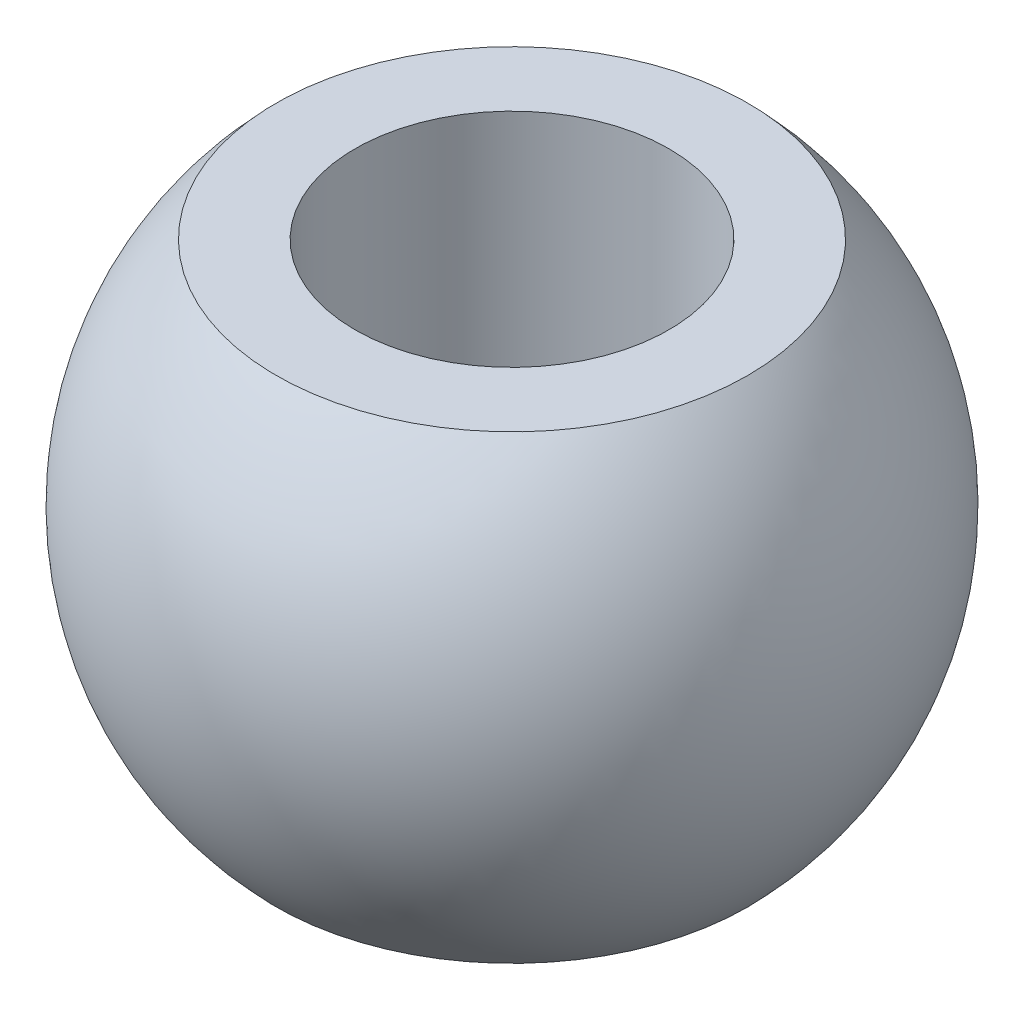
ISO-10303-21;
HEADER;
FILE_DESCRIPTION(('STEP AP214'),'2;1');
FILE_NAME('part.step','',(''),(''),'','','');
FILE_SCHEMA(('AUTOMOTIVE_DESIGN { 1 0 10303 214 1 1 1 1 }'));
ENDSEC;
DATA;
#1=APPLICATION_CONTEXT('core data for automotive mechanical design processes');
#2=APPLICATION_PROTOCOL_DEFINITION('international standard','automotive_design',2000,#1);
#3=PRODUCT_CONTEXT('',#1,'mechanical');
#4=PRODUCT('Part','Part','',(#3));
#5=PRODUCT_RELATED_PRODUCT_CATEGORY('part','',(#4));
#6=PRODUCT_DEFINITION_FORMATION('','',#4);
#7=PRODUCT_DEFINITION_CONTEXT('part definition',#1,'design');
#8=PRODUCT_DEFINITION('design','',#6,#7);
#9=PRODUCT_DEFINITION_SHAPE('','',#8);
#10=(LENGTH_UNIT() NAMED_UNIT(*) SI_UNIT(.MILLI.,.METRE.));
#11=(NAMED_UNIT(*) PLANE_ANGLE_UNIT() SI_UNIT($,.RADIAN.));
#12=(NAMED_UNIT(*) SI_UNIT($,.STERADIAN.) SOLID_ANGLE_UNIT());
#13=UNCERTAINTY_MEASURE_WITH_UNIT(LENGTH_MEASURE(1.E-05),#10,'distance_accuracy_value','');
#14=(GEOMETRIC_REPRESENTATION_CONTEXT(3) GLOBAL_UNCERTAINTY_ASSIGNED_CONTEXT((#13)) GLOBAL_UNIT_ASSIGNED_CONTEXT((#10,
#11,#12)) REPRESENTATION_CONTEXT('',''));
#15=CARTESIAN_POINT('',(0.,0.,0.));
#16=DIRECTION('',(0.,0.,1.));
#17=DIRECTION('',(1.,0.,0.));
#18=AXIS2_PLACEMENT_3D('',#15,#16,#17);
#19=CARTESIAN_POINT('',(0.,0.,0.));
#20=DIRECTION('',(0.,1.,0.));
#21=DIRECTION('',(1.,0.,0.));
#22=AXIS2_PLACEMENT_3D('',#19,#20,#21);
#23=SPHERICAL_SURFACE('',#22,3.15);
#24=CARTESIAN_POINT('',(0.,2.2,0.));
#25=DIRECTION('',(0.,1.,0.));
#26=DIRECTION('',(0.,0.,1.));
#27=AXIS2_PLACEMENT_3D('',#24,#25,#26);
#28=CIRCLE('',#27,2.2544400635191);
#29=CARTESIAN_POINT('',(2.2544400635191,2.2,0.));
#30=VERTEX_POINT('',#29);
#31=EDGE_CURVE('E45',#30,#30,#28,.T.);
#32=CARTESIAN_POINT('',(0.,-2.2,0.));
#33=DIRECTION('',(0.,1.,0.));
#34=DIRECTION('',(0.,0.,1.));
#35=AXIS2_PLACEMENT_3D('',#32,#33,#34);
#36=CIRCLE('',#35,2.2544400635191);
#37=CARTESIAN_POINT('',(2.2544400635191,-2.2,0.));
#38=VERTEX_POINT('',#37);
#39=EDGE_CURVE('E10',#38,#38,#36,.T.);
#40=CARTESIAN_POINT('',(2.2544400635191,2.2,0.));
#41=CARTESIAN_POINT('',(2.28987812241705,2.16368647952332,0.));
#42=CARTESIAN_POINT('',(2.32443726141813,2.12651538343294,0.));
#43=CARTESIAN_POINT('',(2.39172039303971,2.05054781674715,0.));
#44=CARTESIAN_POINT('',(2.42444438566022,2.01175134615174,0.));
#45=CARTESIAN_POINT('',(2.48797991793386,1.93262280717831,0.));
#46=CARTESIAN_POINT('',(2.518791457587,1.89229073880028,0.));
#47=CARTESIAN_POINT('',(2.57843039040885,1.81018538297469,0.));
#48=CARTESIAN_POINT('',(2.60725778357756,1.76841209552712,0.));
#49=CARTESIAN_POINT('',(2.6628610547114,1.68352177265631,0.));
#50=CARTESIAN_POINT('',(2.68963693267654,1.64040473723306,0.));
#51=CARTESIAN_POINT('',(2.74107467681044,1.55292759977531,0.));
#52=CARTESIAN_POINT('',(2.7657365429792,1.50856749774079,0.));
#53=CARTESIAN_POINT('',(2.81288868045417,1.4187077910684,0.));
#54=CARTESIAN_POINT('',(2.83537895176039,1.37320818643051,0.));
#55=CARTESIAN_POINT('',(2.87813539241444,1.28117570421314,0.));
#56=CARTESIAN_POINT('',(2.89840156176227,1.23464282663364,0.));
#57=CARTESIAN_POINT('',(2.93666248245955,1.14065243918694,0.));
#58=CARTESIAN_POINT('',(2.95465723380899,1.09319492931974,0.));
#59=CARTESIAN_POINT('',(2.98833330600524,0.997466077079587,0.));
#60=CARTESIAN_POINT('',(3.00401462685205,0.94919473470664,0.));
#61=CARTESIAN_POINT('',(3.03302722662306,0.851950917202105,0.));
#62=CARTESIAN_POINT('',(3.04635850554726,0.802978442070517,0.));
#63=CARTESIAN_POINT('',(3.07063989675882,0.704446695767136,0.));
#64=CARTESIAN_POINT('',(3.08159000904619,0.654887424595344,0.));
#65=CARTESIAN_POINT('',(3.10108350160426,0.555297792923554,0.));
#66=CARTESIAN_POINT('',(3.10962688187497,0.505267432423556,0.));
#67=CARTESIAN_POINT('',(3.12428696405253,0.404852428668045,0.));
#68=CARTESIAN_POINT('',(3.13040366595937,0.354467785412531,0.));
#69=CARTESIAN_POINT('',(3.1401961106608,0.253461849866987,0.));
#70=CARTESIAN_POINT('',(3.14387185345539,0.202840557576957,0.));
#71=CARTESIAN_POINT('',(3.14877379812499,0.101479510191285,0.));
#72=CARTESIAN_POINT('',(3.15,0.0507397550956423,0.));
#73=CARTESIAN_POINT('',(3.15,-0.050739755095643,0.));
#74=CARTESIAN_POINT('',(3.14877379812499,-0.101479510191286,0.));
#75=CARTESIAN_POINT('',(3.14387185345539,-0.202840557576958,0.));
#76=CARTESIAN_POINT('',(3.1401961106608,-0.253461849866988,0.));
#77=CARTESIAN_POINT('',(3.13040366595937,-0.354467785412531,0.));
#78=CARTESIAN_POINT('',(3.12428696405253,-0.404852428668045,0.));
#79=CARTESIAN_POINT('',(3.10962688187497,-0.505267432423557,0.));
#80=CARTESIAN_POINT('',(3.10108350160426,-0.555297792923554,0.));
#81=CARTESIAN_POINT('',(3.08159000904619,-0.654887424595344,0.));
#82=CARTESIAN_POINT('',(3.07063989675882,-0.704446695767137,0.));
#83=CARTESIAN_POINT('',(3.04635850554726,-0.802978442070517,0.));
#84=CARTESIAN_POINT('',(3.03302722662306,-0.851950917202105,0.));
#85=CARTESIAN_POINT('',(3.00401462685205,-0.94919473470664,0.));
#86=CARTESIAN_POINT('',(2.98833330600524,-0.997466077079587,0.));
#87=CARTESIAN_POINT('',(2.95465723380899,-1.09319492931974,0.));
#88=CARTESIAN_POINT('',(2.93666248245955,-1.14065243918694,0.));
#89=CARTESIAN_POINT('',(2.89840156176227,-1.23464282663364,0.));
#90=CARTESIAN_POINT('',(2.87813539241444,-1.28117570421314,0.));
#91=CARTESIAN_POINT('',(2.83537895176039,-1.37320818643051,0.));
#92=CARTESIAN_POINT('',(2.81288868045417,-1.4187077910684,0.));
#93=CARTESIAN_POINT('',(2.7657365429792,-1.50856749774079,0.));
#94=CARTESIAN_POINT('',(2.74107467681044,-1.55292759977531,0.));
#95=CARTESIAN_POINT('',(2.68963693267654,-1.64040473723307,0.));
#96=CARTESIAN_POINT('',(2.6628610547114,-1.68352177265631,0.));
#97=CARTESIAN_POINT('',(2.60725778357756,-1.76841209552712,0.));
#98=CARTESIAN_POINT('',(2.57843039040885,-1.81018538297469,0.));
#99=CARTESIAN_POINT('',(2.518791457587,-1.89229073880028,0.));
#100=CARTESIAN_POINT('',(2.48797991793386,-1.93262280717831,0.));
#101=CARTESIAN_POINT('',(2.42444438566022,-2.01175134615174,0.));
#102=CARTESIAN_POINT('',(2.39172039303971,-2.05054781674715,0.));
#103=CARTESIAN_POINT('',(2.32443726141813,-2.12651538343294,0.));
#104=CARTESIAN_POINT('',(2.28987812241705,-2.16368647952332,0.));
#105=CARTESIAN_POINT('',(2.2544400635191,-2.2,0.));
#106=B_SPLINE_CURVE_WITH_KNOTS('',3,(#40,#41,#42,#43,#44,#45,#46,#47,#48,#49,#50,#51,#52,#53,
#54,#55,#56,#57,#58,#59,#60,#61,#62,#63,#64,#65,#66,#67,#68,#69,#70,#71,#72,#73,#74,#75,#76,#77,
#78,#79,#80,#81,#82,#83,#84,#85,#86,#87,#88,#89,#90,#91,#92,#93,#94,#95,#96,#97,#98,#99,#100,
#101,#102,#103,#104,#105),.UNSPECIFIED.,.F.,.F.,(4,2,2,2,2,2,2,2,2,2,2,2,2,2,2,2,2,2,2,2,2,2,2,
2,2,2,2,2,2,2,2,2,4),(0.,0.152204459598877,0.304408919197755,0.456613378796632,
0.608817838395509,0.761022297994386,0.913226757593264,1.06543121719214,1.21763567679102,
1.3698401363899,1.52204459598877,1.67424905558765,1.82645351518653,1.9786579747854,
2.13086243438428,2.28306689398316,2.43527135358204,2.58747581318091,2.73968027277979,
2.89188473237867,3.04408919197754,3.19629365157642,3.3484981111753,3.50070257077418,
3.65290703037305,3.80511148997193,3.95731594957081,4.10952040916969,4.26172486876856,
4.41392932836744,4.56613378796632,4.7183382475652,4.87054270716407),.UNSPECIFIED.);
#107=EDGE_CURVE('BSEAM31',#30,#38,#106,.T.);
#108=ORIENTED_EDGE('',*,*,#31,.F.);
#109=ORIENTED_EDGE('',*,*,#39,.T.);
#110=ORIENTED_EDGE('',*,*,#107,.T.);
#111=ORIENTED_EDGE('',*,*,#107,.F.);
#112=EDGE_LOOP('',(#108,#110,#109,#111));
#113=FACE_BOUND('',#112,.T.);
#114=ADVANCED_FACE('F31',(#113),#23,.T.);
#115=CARTESIAN_POINT('',(1.5,-2.2,0.));
#116=DIRECTION('',(0.,1.,0.));
#117=DIRECTION('',(0.,0.,1.));
#118=AXIS2_PLACEMENT_3D('',#115,#116,#117);
#119=PLANE('',#118);
#120=ORIENTED_EDGE('',*,*,#39,.F.);
#121=EDGE_LOOP('',(#120));
#122=FACE_BOUND('',#121,.T.);
#123=CARTESIAN_POINT('',(0.,-2.2,0.));
#124=DIRECTION('',(0.,1.,0.));
#125=DIRECTION('',(0.,0.,1.));
#126=AXIS2_PLACEMENT_3D('',#123,#124,#125);
#127=CIRCLE('',#126,1.5);
#128=CARTESIAN_POINT('',(0.,-2.2,1.5));
#129=VERTEX_POINT('',#128);
#130=EDGE_CURVE('E37',#129,#129,#127,.T.);
#131=ORIENTED_EDGE('',*,*,#130,.T.);
#132=EDGE_LOOP('',(#131));
#133=FACE_BOUND('',#132,.T.);
#134=ADVANCED_FACE('F54',(#122,#133),#119,.F.);
#135=CARTESIAN_POINT('',(0.,2.0559104927429,0.));
#136=DIRECTION('',(0.,1.,0.));
#137=DIRECTION('',(0.,0.,1.));
#138=AXIS2_PLACEMENT_3D('',#135,#136,#137);
#139=CYLINDRICAL_SURFACE('',#138,1.5);
#140=ORIENTED_EDGE('',*,*,#130,.F.);
#141=EDGE_LOOP('',(#140));
#142=FACE_BOUND('',#141,.T.);
#143=CARTESIAN_POINT('',(0.,2.2,0.));
#144=DIRECTION('',(0.,1.,0.));
#145=DIRECTION('',(0.,0.,1.));
#146=AXIS2_PLACEMENT_3D('',#143,#144,#145);
#147=CIRCLE('',#146,1.5);
#148=CARTESIAN_POINT('',(0.,2.2,1.5));
#149=VERTEX_POINT('',#148);
#150=EDGE_CURVE('E41',#149,#149,#147,.T.);
#151=ORIENTED_EDGE('',*,*,#150,.T.);
#152=EDGE_LOOP('',(#151));
#153=FACE_BOUND('',#152,.T.);
#154=ADVANCED_FACE('F58',(#142,#153),#139,.F.);
#155=CARTESIAN_POINT('',(2.2544400635191,2.2,0.));
#156=DIRECTION('',(0.,-1.,0.));
#157=DIRECTION('',(0.,0.,-1.));
#158=AXIS2_PLACEMENT_3D('',#155,#156,#157);
#159=PLANE('',#158);
#160=ORIENTED_EDGE('',*,*,#150,.F.);
#161=EDGE_LOOP('',(#160));
#162=FACE_BOUND('',#161,.T.);
#163=ORIENTED_EDGE('',*,*,#31,.T.);
#164=EDGE_LOOP('',(#163));
#165=FACE_BOUND('',#164,.T.);
#166=ADVANCED_FACE('F51',(#162,#165),#159,.F.);
#167=CLOSED_SHELL('',(#114,#134,#154,#166));
#168=MANIFOLD_SOLID_BREP('B2',#167);
#169=ADVANCED_BREP_SHAPE_REPRESENTATION('',(#18,#168),#14);
#170=SHAPE_DEFINITION_REPRESENTATION(#9,#169);
ENDSEC;
END-ISO-10303-21;
